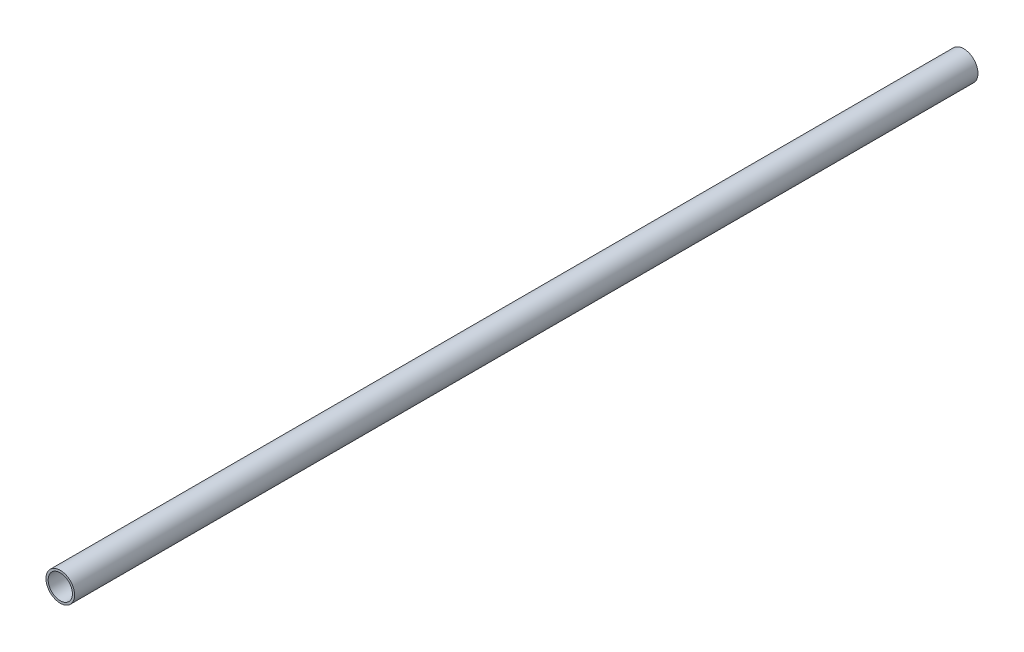
ISO-10303-21;
HEADER;
FILE_DESCRIPTION(('STEP AP214'),'2;1');
FILE_NAME('part.step','',(''),(''),'','','');
FILE_SCHEMA(('AUTOMOTIVE_DESIGN { 1 0 10303 214 1 1 1 1 }'));
ENDSEC;
DATA;
#1=APPLICATION_CONTEXT('core data for automotive mechanical design processes');
#2=APPLICATION_PROTOCOL_DEFINITION('international standard','automotive_design',2000,#1);
#3=PRODUCT_CONTEXT('',#1,'mechanical');
#4=PRODUCT('Part','Part','',(#3));
#5=PRODUCT_RELATED_PRODUCT_CATEGORY('part','',(#4));
#6=PRODUCT_DEFINITION_FORMATION('','',#4);
#7=PRODUCT_DEFINITION_CONTEXT('part definition',#1,'design');
#8=PRODUCT_DEFINITION('design','',#6,#7);
#9=PRODUCT_DEFINITION_SHAPE('','',#8);
#10=(LENGTH_UNIT() NAMED_UNIT(*) SI_UNIT(.MILLI.,.METRE.));
#11=(NAMED_UNIT(*) PLANE_ANGLE_UNIT() SI_UNIT($,.RADIAN.));
#12=(NAMED_UNIT(*) SI_UNIT($,.STERADIAN.) SOLID_ANGLE_UNIT());
#13=UNCERTAINTY_MEASURE_WITH_UNIT(LENGTH_MEASURE(1.E-05),#10,'distance_accuracy_value','');
#14=(GEOMETRIC_REPRESENTATION_CONTEXT(3) GLOBAL_UNCERTAINTY_ASSIGNED_CONTEXT((#13)) GLOBAL_UNIT_ASSIGNED_CONTEXT((#10,
#11,#12)) REPRESENTATION_CONTEXT('',''));
#15=CARTESIAN_POINT('',(0.,0.,0.));
#16=DIRECTION('',(0.,0.,1.));
#17=DIRECTION('',(1.,0.,0.));
#18=AXIS2_PLACEMENT_3D('',#15,#16,#17);
#19=CARTESIAN_POINT('',(0.,0.,-762.));
#20=DIRECTION('',(0.,0.,1.));
#21=DIRECTION('',(1.,0.,0.));
#22=AXIS2_PLACEMENT_3D('',#19,#20,#21);
#23=CYLINDRICAL_SURFACE('',#22,24.13);
#24=CARTESIAN_POINT('',(0.,0.,-762.));
#25=DIRECTION('',(0.,0.,1.));
#26=DIRECTION('',(1.,0.,0.));
#27=AXIS2_PLACEMENT_3D('',#24,#25,#26);
#28=CIRCLE('',#27,24.13);
#29=CARTESIAN_POINT('',(24.13,0.,-762.));
#30=VERTEX_POINT('',#29);
#31=EDGE_CURVE('E10',#30,#30,#28,.T.);
#32=ORIENTED_EDGE('',*,*,#31,.T.);
#33=EDGE_LOOP('',(#32));
#34=FACE_BOUND('',#33,.T.);
#35=CARTESIAN_POINT('',(0.,0.,762.));
#36=DIRECTION('',(0.,0.,1.));
#37=DIRECTION('',(1.,0.,0.));
#38=AXIS2_PLACEMENT_3D('',#35,#36,#37);
#39=CIRCLE('',#38,24.13);
#40=CARTESIAN_POINT('',(24.13,0.,762.));
#41=VERTEX_POINT('',#40);
#42=EDGE_CURVE('E42',#41,#41,#39,.T.);
#43=ORIENTED_EDGE('',*,*,#42,.F.);
#44=EDGE_LOOP('',(#43));
#45=FACE_BOUND('',#44,.T.);
#46=ADVANCED_FACE('F32',(#34,#45),#23,.T.);
#47=CARTESIAN_POINT('',(0.,0.,-762.));
#48=DIRECTION('',(0.,0.,1.));
#49=DIRECTION('',(1.,0.,0.));
#50=AXIS2_PLACEMENT_3D('',#47,#48,#49);
#51=PLANE('',#50);
#52=CARTESIAN_POINT('',(0.,0.,-762.));
#53=DIRECTION('',(0.,0.,1.));
#54=DIRECTION('',(1.,0.,0.));
#55=AXIS2_PLACEMENT_3D('',#52,#53,#54);
#56=CIRCLE('',#55,20.447);
#57=CARTESIAN_POINT('',(20.447,0.,-762.));
#58=VERTEX_POINT('',#57);
#59=EDGE_CURVE('E38',#58,#58,#56,.T.);
#60=ORIENTED_EDGE('',*,*,#59,.T.);
#61=EDGE_LOOP('',(#60));
#62=FACE_BOUND('',#61,.T.);
#63=ORIENTED_EDGE('',*,*,#31,.F.);
#64=EDGE_LOOP('',(#63));
#65=FACE_BOUND('',#64,.T.);
#66=ADVANCED_FACE('F61',(#62,#65),#51,.F.);
#67=CARTESIAN_POINT('',(0.,0.,-762.));
#68=DIRECTION('',(0.,0.,1.));
#69=DIRECTION('',(1.,0.,0.));
#70=AXIS2_PLACEMENT_3D('',#67,#68,#69);
#71=CYLINDRICAL_SURFACE('',#70,20.447);
#72=ORIENTED_EDGE('',*,*,#59,.F.);
#73=EDGE_LOOP('',(#72));
#74=FACE_BOUND('',#73,.T.);
#75=CARTESIAN_POINT('',(0.,0.,762.));
#76=DIRECTION('',(0.,0.,1.));
#77=DIRECTION('',(1.,0.,0.));
#78=AXIS2_PLACEMENT_3D('',#75,#76,#77);
#79=CIRCLE('',#78,20.447);
#80=CARTESIAN_POINT('',(20.447,0.,762.));
#81=VERTEX_POINT('',#80);
#82=EDGE_CURVE('E46',#81,#81,#79,.T.);
#83=ORIENTED_EDGE('',*,*,#82,.T.);
#84=EDGE_LOOP('',(#83));
#85=FACE_BOUND('',#84,.T.);
#86=ADVANCED_FACE('F52',(#74,#85),#71,.F.);
#87=CARTESIAN_POINT('',(0.,0.,762.));
#88=DIRECTION('',(0.,0.,1.));
#89=DIRECTION('',(1.,0.,0.));
#90=AXIS2_PLACEMENT_3D('',#87,#88,#89);
#91=PLANE('',#90);
#92=ORIENTED_EDGE('',*,*,#42,.T.);
#93=EDGE_LOOP('',(#92));
#94=FACE_BOUND('',#93,.T.);
#95=ORIENTED_EDGE('',*,*,#82,.F.);
#96=EDGE_LOOP('',(#95));
#97=FACE_BOUND('',#96,.T.);
#98=ADVANCED_FACE('F54',(#94,#97),#91,.T.);
#99=CLOSED_SHELL('',(#46,#66,#86,#98));
#100=MANIFOLD_SOLID_BREP('B2',#99);
#101=ADVANCED_BREP_SHAPE_REPRESENTATION('',(#18,#100),#14);
#102=SHAPE_DEFINITION_REPRESENTATION(#9,#101);
ENDSEC;
END-ISO-10303-21;
